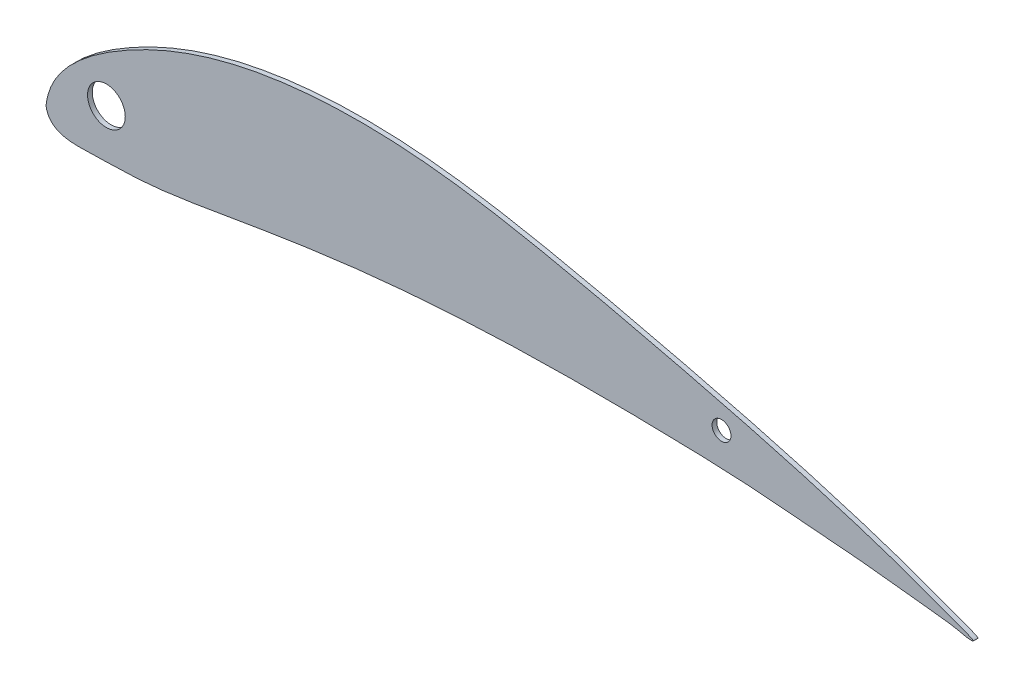
ISO-10303-21;
HEADER;
FILE_DESCRIPTION(('STEP AP214'),'2;1');
FILE_NAME('part.step','',(''),(''),'','','');
FILE_SCHEMA(('AUTOMOTIVE_DESIGN { 1 0 10303 214 1 1 1 1 }'));
ENDSEC;
DATA;
#1=APPLICATION_CONTEXT('core data for automotive mechanical design processes');
#2=APPLICATION_PROTOCOL_DEFINITION('international standard','automotive_design',2000,#1);
#3=PRODUCT_CONTEXT('',#1,'mechanical');
#4=PRODUCT('Part','Part','',(#3));
#5=PRODUCT_RELATED_PRODUCT_CATEGORY('part','',(#4));
#6=PRODUCT_DEFINITION_FORMATION('','',#4);
#7=PRODUCT_DEFINITION_CONTEXT('part definition',#1,'design');
#8=PRODUCT_DEFINITION('design','',#6,#7);
#9=PRODUCT_DEFINITION_SHAPE('','',#8);
#10=(LENGTH_UNIT() NAMED_UNIT(*) SI_UNIT(.MILLI.,.METRE.));
#11=(NAMED_UNIT(*) PLANE_ANGLE_UNIT() SI_UNIT($,.RADIAN.));
#12=(NAMED_UNIT(*) SI_UNIT($,.STERADIAN.) SOLID_ANGLE_UNIT());
#13=UNCERTAINTY_MEASURE_WITH_UNIT(LENGTH_MEASURE(1.E-05),#10,'distance_accuracy_value','');
#14=(GEOMETRIC_REPRESENTATION_CONTEXT(3) GLOBAL_UNCERTAINTY_ASSIGNED_CONTEXT((#13)) GLOBAL_UNIT_ASSIGNED_CONTEXT((#10,
#11,#12)) REPRESENTATION_CONTEXT('',''));
#15=CARTESIAN_POINT('',(0.,0.,0.));
#16=DIRECTION('',(0.,0.,1.));
#17=DIRECTION('',(1.,0.,0.));
#18=AXIS2_PLACEMENT_3D('',#15,#16,#17);
#19=CARTESIAN_POINT('',(0.000560351162113587,0.000130087070423624,1.5875));
#20=CARTESIAN_POINT('',(1.23071418869678,-6.92407609127206,1.5875));
#21=CARTESIAN_POINT('',(15.3166033306834,-6.18906584099094,1.5875));
#22=CARTESIAN_POINT('',(36.4546728163185,-6.09849990105009,1.5875));
#23=CARTESIAN_POINT('',(66.5061971849192,-0.586669106973501,1.5875));
#24=CARTESIAN_POINT('',(110.497331171581,6.18149522271792,1.5875));
#25=CARTESIAN_POINT('',(157.718638091679,9.03065014873911,1.5875));
#26=CARTESIAN_POINT('',(205.10142463584,8.83808028186313,1.5875));
#27=CARTESIAN_POINT('',(235.858814759408,7.87030619247826,1.5875));
#28=CARTESIAN_POINT('',(260.846344817159,5.42741339404395,1.5875));
#29=CARTESIAN_POINT('',(276.264022989737,4.51435670375389,1.5875));
#30=CARTESIAN_POINT('',(293.989507544058,2.09398731346533,1.5875));
#31=CARTESIAN_POINT('',(303.956832564589,1.47095520994628,1.5875));
#32=CARTESIAN_POINT('',(309.846313894505,0.000130087070423666,1.5875));
#33=B_SPLINE_CURVE_WITH_KNOTS('',3,(#19,#20,#21,#22,#23,#24,#25,#26,#27,#28,#29,#30,#31,#32),
.UNSPECIFIED.,.F.,.F.,(4,1,1,1,1,1,1,1,1,1,1,4),(0.,0.0569078595717698,0.106482711504673,
0.214488052979465,0.341297688349143,0.535095665520157,0.664680853556909,0.794660698192775,
0.828978881532905,0.904725108725214,0.942212919019968,1.),.UNSPECIFIED.);
#34=DIRECTION('',(0.,0.,-1.));
#35=VECTOR('',#34,1.);
#36=SURFACE_OF_LINEAR_EXTRUSION('',#33,#35);
#37=CARTESIAN_POINT('',(0.000560351162113587,0.000130087070423624,0.));
#38=CARTESIAN_POINT('',(1.23071418869678,-6.92407609127206,0.));
#39=CARTESIAN_POINT('',(15.3166033306834,-6.18906584099094,0.));
#40=CARTESIAN_POINT('',(36.4546728163185,-6.09849990105009,0.));
#41=CARTESIAN_POINT('',(66.5061971849192,-0.586669106973501,0.));
#42=CARTESIAN_POINT('',(110.497331171581,6.18149522271792,0.));
#43=CARTESIAN_POINT('',(157.718638091679,9.03065014873911,0.));
#44=CARTESIAN_POINT('',(205.10142463584,8.83808028186313,0.));
#45=CARTESIAN_POINT('',(235.858814759408,7.87030619247826,0.));
#46=CARTESIAN_POINT('',(260.846344817159,5.42741339404395,0.));
#47=CARTESIAN_POINT('',(276.264022989737,4.51435670375389,0.));
#48=CARTESIAN_POINT('',(293.989507544058,2.09398731346533,0.));
#49=CARTESIAN_POINT('',(303.956832564589,1.47095520994628,0.));
#50=CARTESIAN_POINT('',(309.846313894505,0.000130087070423666,0.));
#51=B_SPLINE_CURVE_WITH_KNOTS('',3,(#37,#38,#39,#40,#41,#42,#43,#44,#45,#46,#47,#48,#49,#50),
.UNSPECIFIED.,.F.,.F.,(4,1,1,1,1,1,1,1,1,1,1,4),(0.,0.0569078595717698,0.106482711504673,
0.214488052979465,0.341297688349143,0.535095665520157,0.664680853556909,0.794660698192775,
0.828978881532905,0.904725108725214,0.942212919019968,1.),.UNSPECIFIED.);
#52=CARTESIAN_POINT('',(0.000560351162116727,0.000130087070423829,0.));
#53=VERTEX_POINT('',#52);
#54=CARTESIAN_POINT('',(309.846313894505,0.000130087070423864,0.));
#55=VERTEX_POINT('',#54);
#56=EDGE_CURVE('E75',#53,#55,#51,.T.);
#57=ORIENTED_EDGE('',*,*,#56,.T.);
#58=DIRECTION('',(0.,0.,-1.));
#59=VECTOR('',#58,1.);
#60=CARTESIAN_POINT('',(309.846313894505,0.000130087070423864,1.5875));
#61=LINE('',#60,#59);
#62=CARTESIAN_POINT('',(309.846313894505,0.000130087070423864,1.5875));
#63=VERTEX_POINT('',#62);
#64=EDGE_CURVE('E11',#63,#55,#61,.T.);
#65=ORIENTED_EDGE('',*,*,#64,.F.);
#66=CARTESIAN_POINT('',(0.000560351162116727,0.000130087070423829,1.5875));
#67=VERTEX_POINT('',#66);
#68=EDGE_CURVE('E74',#67,#63,#33,.T.);
#69=ORIENTED_EDGE('',*,*,#68,.F.);
#70=DIRECTION('',(0.,0.,-1.));
#71=VECTOR('',#70,1.);
#72=CARTESIAN_POINT('',(0.000560351162116727,0.000130087070423829,1.5875));
#73=LINE('',#72,#71);
#74=EDGE_CURVE('E51',#67,#53,#73,.T.);
#75=ORIENTED_EDGE('',*,*,#74,.T.);
#76=EDGE_LOOP('',(#57,#65,#69,#75));
#77=FACE_BOUND('',#76,.T.);
#78=ADVANCED_FACE('F41',(#77),#36,.F.);
#79=CARTESIAN_POINT('',(309.846313894505,0.000130087070423864,1.5875));
#80=CARTESIAN_POINT('',(314.816918223261,-0.51620674157964,1.5875));
#81=CARTESIAN_POINT('',(301.273197720551,4.38282813873556,1.5875));
#82=CARTESIAN_POINT('',(290.359837670022,8.71099439045776,1.5875));
#83=CARTESIAN_POINT('',(256.952064400645,19.5289209482833,1.5875));
#84=CARTESIAN_POINT('',(217.961060472083,29.6129748944238,1.5875));
#85=CARTESIAN_POINT('',(173.256699242147,40.0411042779434,1.5875));
#86=CARTESIAN_POINT('',(131.400792108858,47.8848319151037,1.5875));
#87=CARTESIAN_POINT('',(89.5976184754884,49.290763053775,1.5875));
#88=CARTESIAN_POINT('',(52.1111282710831,42.0692152748914,1.5875));
#89=CARTESIAN_POINT('',(26.2867198183782,29.9751763284633,1.5875));
#90=CARTESIAN_POINT('',(8.64909202481883,17.8566051741579,1.5875));
#91=CARTESIAN_POINT('',(0.810633126632263,7.35919605469637,1.5875));
#92=CARTESIAN_POINT('',(0.000560351162116727,0.000130087070423829,1.5875));
#93=B_SPLINE_CURVE_WITH_KNOTS('',3,(#79,#80,#81,#82,#83,#84,#85,#86,#87,#88,#89,#90,#91,#92),
.UNSPECIFIED.,.F.,.F.,(4,1,1,1,1,1,1,1,1,1,1,4),(0.,0.0239417713693992,0.070244030177139,
0.147561721425381,0.308455887006792,0.442387865106874,0.551517565626309,0.687091076796298,
0.811391258419108,0.886311735305172,0.939136382225768,1.),.UNSPECIFIED.);
#94=DIRECTION('',(0.,0.,-1.));
#95=VECTOR('',#94,1.);
#96=SURFACE_OF_LINEAR_EXTRUSION('',#93,#95);
#97=CARTESIAN_POINT('',(309.846313894505,0.000130087070423864,0.));
#98=CARTESIAN_POINT('',(314.816918223261,-0.51620674157964,0.));
#99=CARTESIAN_POINT('',(301.273197720551,4.38282813873556,0.));
#100=CARTESIAN_POINT('',(290.359837670022,8.71099439045776,0.));
#101=CARTESIAN_POINT('',(256.952064400645,19.5289209482833,0.));
#102=CARTESIAN_POINT('',(217.961060472083,29.6129748944238,0.));
#103=CARTESIAN_POINT('',(173.256699242147,40.0411042779434,0.));
#104=CARTESIAN_POINT('',(131.400792108858,47.8848319151037,0.));
#105=CARTESIAN_POINT('',(89.5976184754884,49.290763053775,0.));
#106=CARTESIAN_POINT('',(52.1111282710831,42.0692152748914,0.));
#107=CARTESIAN_POINT('',(26.2867198183782,29.9751763284633,0.));
#108=CARTESIAN_POINT('',(8.64909202481883,17.8566051741579,0.));
#109=CARTESIAN_POINT('',(0.810633126632263,7.35919605469637,0.));
#110=CARTESIAN_POINT('',(0.000560351162116727,0.000130087070423829,0.));
#111=B_SPLINE_CURVE_WITH_KNOTS('',3,(#97,#98,#99,#100,#101,#102,#103,#104,#105,#106,#107,#108,
#109,#110),.UNSPECIFIED.,.F.,.F.,(4,1,1,1,1,1,1,1,1,1,1,4),(0.,0.0239417713693992,
0.070244030177139,0.147561721425381,0.308455887006792,0.442387865106874,0.551517565626309,
0.687091076796298,0.811391258419108,0.886311735305172,0.939136382225768,1.),.UNSPECIFIED.);
#112=EDGE_CURVE('E66',#55,#53,#111,.T.);
#113=ORIENTED_EDGE('',*,*,#112,.T.);
#114=ORIENTED_EDGE('',*,*,#74,.F.);
#115=EDGE_CURVE('E58',#63,#67,#93,.T.);
#116=ORIENTED_EDGE('',*,*,#115,.F.);
#117=ORIENTED_EDGE('',*,*,#64,.T.);
#118=EDGE_LOOP('',(#113,#114,#116,#117));
#119=FACE_BOUND('',#118,.T.);
#120=ADVANCED_FACE('F69',(#119),#96,.F.);
#121=CARTESIAN_POINT('',(153.387816973495,8.33338198857885,1.5875));
#122=DIRECTION('',(0.,0.,-1.));
#123=DIRECTION('',(-1.,0.,0.));
#124=AXIS2_PLACEMENT_3D('',#121,#122,#123);
#125=PLANE('',#124);
#126=CARTESIAN_POINT('',(20.32,10.16,1.5875));
#127=DIRECTION('',(0.,0.,1.));
#128=DIRECTION('',(1.,0.,0.));
#129=AXIS2_PLACEMENT_3D('',#126,#127,#128);
#130=CIRCLE('',#129,6.35000000000001);
#131=CARTESIAN_POINT('',(26.67,10.16,1.5875));
#132=VERTEX_POINT('',#131);
#133=EDGE_CURVE('E85',#132,#132,#130,.T.);
#134=ORIENTED_EDGE('',*,*,#133,.F.);
#135=EDGE_LOOP('',(#134));
#136=FACE_BOUND('',#135,.T.);
#137=CARTESIAN_POINT('',(227.296313894505,19.0501300870704,1.5875));
#138=DIRECTION('',(0.,0.,1.));
#139=DIRECTION('',(1.,0.,0.));
#140=AXIS2_PLACEMENT_3D('',#137,#138,#139);
#141=CIRCLE('',#140,3.175);
#142=CARTESIAN_POINT('',(230.471313894505,19.0501300870704,1.5875));
#143=VERTEX_POINT('',#142);
#144=EDGE_CURVE('E171',#143,#143,#141,.T.);
#145=ORIENTED_EDGE('',*,*,#144,.F.);
#146=EDGE_LOOP('',(#145));
#147=FACE_BOUND('',#146,.T.);
#148=ORIENTED_EDGE('',*,*,#68,.T.);
#149=ORIENTED_EDGE('',*,*,#115,.T.);
#150=EDGE_LOOP('',(#148,#149));
#151=FACE_BOUND('',#150,.T.);
#152=ADVANCED_FACE('F111',(#136,#147,#151),#125,.F.);
#153=CARTESIAN_POINT('',(153.387816973495,8.33338198857885,0.));
#154=DIRECTION('',(0.,0.,-1.));
#155=DIRECTION('',(-1.,0.,0.));
#156=AXIS2_PLACEMENT_3D('',#153,#154,#155);
#157=PLANE('',#156);
#158=CARTESIAN_POINT('',(20.32,10.16,0.));
#159=DIRECTION('',(0.,0.,1.));
#160=DIRECTION('',(1.,0.,0.));
#161=AXIS2_PLACEMENT_3D('',#158,#159,#160);
#162=CIRCLE('',#161,6.35000000000001);
#163=CARTESIAN_POINT('',(26.67,10.16,0.));
#164=VERTEX_POINT('',#163);
#165=EDGE_CURVE('E81',#164,#164,#162,.T.);
#166=ORIENTED_EDGE('',*,*,#165,.T.);
#167=EDGE_LOOP('',(#166));
#168=FACE_BOUND('',#167,.T.);
#169=CARTESIAN_POINT('',(227.296313894505,19.0501300870704,0.));
#170=DIRECTION('',(0.,0.,1.));
#171=DIRECTION('',(1.,0.,0.));
#172=AXIS2_PLACEMENT_3D('',#169,#170,#171);
#173=CIRCLE('',#172,3.175);
#174=CARTESIAN_POINT('',(230.471313894505,19.0501300870704,0.));
#175=VERTEX_POINT('',#174);
#176=EDGE_CURVE('E167',#175,#175,#173,.T.);
#177=ORIENTED_EDGE('',*,*,#176,.T.);
#178=EDGE_LOOP('',(#177));
#179=FACE_BOUND('',#178,.T.);
#180=ORIENTED_EDGE('',*,*,#56,.F.);
#181=ORIENTED_EDGE('',*,*,#112,.F.);
#182=EDGE_LOOP('',(#180,#181));
#183=FACE_BOUND('',#182,.T.);
#184=ADVANCED_FACE('F79',(#168,#179,#183),#157,.T.);
#185=CARTESIAN_POINT('',(227.296313894505,19.0501300870704,0.));
#186=DIRECTION('',(0.,0.,1.));
#187=DIRECTION('',(1.,0.,0.));
#188=AXIS2_PLACEMENT_3D('',#185,#186,#187);
#189=CYLINDRICAL_SURFACE('',#188,3.175);
#190=ORIENTED_EDGE('',*,*,#176,.F.);
#191=EDGE_LOOP('',(#190));
#192=FACE_BOUND('',#191,.T.);
#193=ORIENTED_EDGE('',*,*,#144,.T.);
#194=EDGE_LOOP('',(#193));
#195=FACE_BOUND('',#194,.T.);
#196=ADVANCED_FACE('F114',(#192,#195),#189,.F.);
#197=CARTESIAN_POINT('',(20.32,10.16,0.));
#198=DIRECTION('',(0.,0.,1.));
#199=DIRECTION('',(1.,0.,0.));
#200=AXIS2_PLACEMENT_3D('',#197,#198,#199);
#201=CYLINDRICAL_SURFACE('',#200,6.35000000000001);
#202=ORIENTED_EDGE('',*,*,#165,.F.);
#203=EDGE_LOOP('',(#202));
#204=FACE_BOUND('',#203,.T.);
#205=ORIENTED_EDGE('',*,*,#133,.T.);
#206=EDGE_LOOP('',(#205));
#207=FACE_BOUND('',#206,.T.);
#208=ADVANCED_FACE('F121',(#204,#207),#201,.F.);
#209=CLOSED_SHELL('',(#78,#120,#152,#184,#196,#208));
#210=MANIFOLD_SOLID_BREP('B2',#209);
#211=ADVANCED_BREP_SHAPE_REPRESENTATION('',(#18,#210),#14);
#212=SHAPE_DEFINITION_REPRESENTATION(#9,#211);
ENDSEC;
END-ISO-10303-21;
